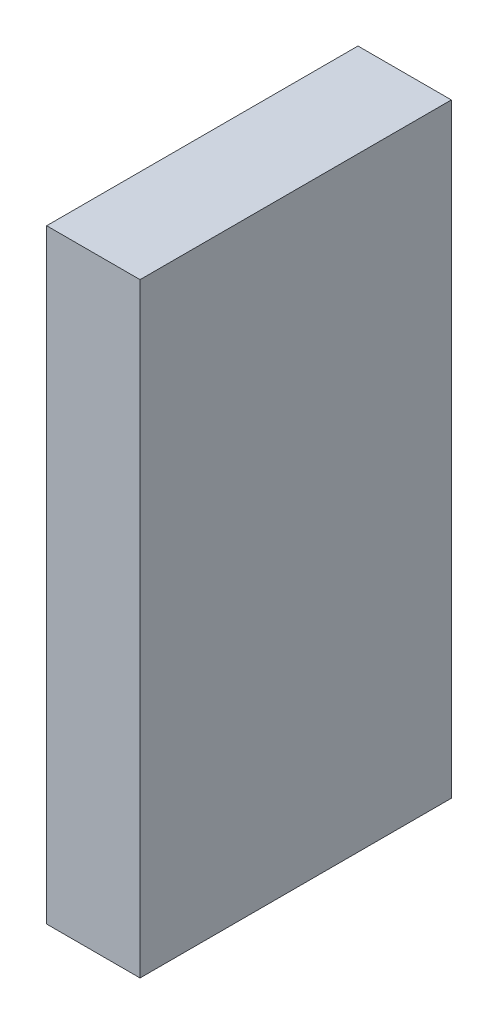
ISO-10303-21;
HEADER;
FILE_DESCRIPTION(('STEP AP214'),'2;1');
FILE_NAME('part.step','',(''),(''),'','','');
FILE_SCHEMA(('AUTOMOTIVE_DESIGN { 1 0 10303 214 1 1 1 1 }'));
ENDSEC;
DATA;
#1=APPLICATION_CONTEXT('core data for automotive mechanical design processes');
#2=APPLICATION_PROTOCOL_DEFINITION('international standard','automotive_design',2000,#1);
#3=PRODUCT_CONTEXT('',#1,'mechanical');
#4=PRODUCT('Part','Part','',(#3));
#5=PRODUCT_RELATED_PRODUCT_CATEGORY('part','',(#4));
#6=PRODUCT_DEFINITION_FORMATION('','',#4);
#7=PRODUCT_DEFINITION_CONTEXT('part definition',#1,'design');
#8=PRODUCT_DEFINITION('design','',#6,#7);
#9=PRODUCT_DEFINITION_SHAPE('','',#8);
#10=(LENGTH_UNIT() NAMED_UNIT(*) SI_UNIT(.MILLI.,.METRE.));
#11=(NAMED_UNIT(*) PLANE_ANGLE_UNIT() SI_UNIT($,.RADIAN.));
#12=(NAMED_UNIT(*) SI_UNIT($,.STERADIAN.) SOLID_ANGLE_UNIT());
#13=UNCERTAINTY_MEASURE_WITH_UNIT(LENGTH_MEASURE(1.E-05),#10,'distance_accuracy_value','');
#14=(GEOMETRIC_REPRESENTATION_CONTEXT(3) GLOBAL_UNCERTAINTY_ASSIGNED_CONTEXT((#13)) GLOBAL_UNIT_ASSIGNED_CONTEXT((#10,
#11,#12)) REPRESENTATION_CONTEXT('',''));
#15=CARTESIAN_POINT('',(0.,0.,0.));
#16=DIRECTION('',(0.,0.,1.));
#17=DIRECTION('',(1.,0.,0.));
#18=AXIS2_PLACEMENT_3D('',#15,#16,#17);
#19=CARTESIAN_POINT('',(0.4815,1.7,0.));
#20=DIRECTION('',(1.,0.,0.));
#21=DIRECTION('',(0.,0.,-1.));
#22=AXIS2_PLACEMENT_3D('',#19,#20,#21);
#23=PLANE('',#22);
#24=DIRECTION('',(0.,0.,-1.));
#25=VECTOR('',#24,1.);
#26=CARTESIAN_POINT('',(0.4815,-1.7,0.));
#27=LINE('',#26,#25);
#28=CARTESIAN_POINT('',(0.4815,-1.7,0.));
#29=VERTEX_POINT('',#28);
#30=CARTESIAN_POINT('',(0.4815,-1.7,1.75));
#31=VERTEX_POINT('',#30);
#32=EDGE_CURVE('E19',#29,#31,#27,.F.);
#33=ORIENTED_EDGE('',*,*,#32,.F.);
#34=DIRECTION('',(0.,1.,0.));
#35=VECTOR('',#34,1.);
#36=CARTESIAN_POINT('',(0.4815,-1.7,0.));
#37=LINE('',#36,#35);
#38=CARTESIAN_POINT('',(0.4815,1.7,0.));
#39=VERTEX_POINT('',#38);
#40=EDGE_CURVE('E79',#29,#39,#37,.T.);
#41=ORIENTED_EDGE('',*,*,#40,.T.);
#42=DIRECTION('',(0.,0.,1.));
#43=VECTOR('',#42,1.);
#44=CARTESIAN_POINT('',(0.4815,1.7,0.));
#45=LINE('',#44,#43);
#46=CARTESIAN_POINT('',(0.4815,1.7,1.75));
#47=VERTEX_POINT('',#46);
#48=EDGE_CURVE('E67',#47,#39,#45,.F.);
#49=ORIENTED_EDGE('',*,*,#48,.F.);
#50=DIRECTION('',(0.,1.,0.));
#51=VECTOR('',#50,1.);
#52=CARTESIAN_POINT('',(0.4815,-1.7,1.75));
#53=LINE('',#52,#51);
#54=EDGE_CURVE('E55',#31,#47,#53,.T.);
#55=ORIENTED_EDGE('',*,*,#54,.F.);
#56=EDGE_LOOP('',(#33,#41,#49,#55));
#57=FACE_BOUND('',#56,.T.);
#58=ADVANCED_FACE('F16',(#57),#23,.T.);
#59=CARTESIAN_POINT('',(0.4815,-1.7,0.));
#60=DIRECTION('',(0.,-1.,0.));
#61=DIRECTION('',(0.,0.,-1.));
#62=AXIS2_PLACEMENT_3D('',#59,#60,#61);
#63=PLANE('',#62);
#64=DIRECTION('',(0.,0.,1.));
#65=VECTOR('',#64,1.);
#66=CARTESIAN_POINT('',(-0.0435,-1.7,0.));
#67=LINE('',#66,#65);
#68=CARTESIAN_POINT('',(-0.0435,-1.7,0.));
#69=VERTEX_POINT('',#68);
#70=CARTESIAN_POINT('',(-0.0435,-1.7,1.75));
#71=VERTEX_POINT('',#70);
#72=EDGE_CURVE('E82',#69,#71,#67,.T.);
#73=ORIENTED_EDGE('',*,*,#72,.F.);
#74=DIRECTION('',(1.,0.,0.));
#75=VECTOR('',#74,1.);
#76=CARTESIAN_POINT('',(-0.0435,-1.7,0.));
#77=LINE('',#76,#75);
#78=EDGE_CURVE('E64',#69,#29,#77,.T.);
#79=ORIENTED_EDGE('',*,*,#78,.T.);
#80=ORIENTED_EDGE('',*,*,#32,.T.);
#81=DIRECTION('',(1.,0.,0.));
#82=VECTOR('',#81,1.);
#83=CARTESIAN_POINT('',(-0.0435,-1.7,1.75));
#84=LINE('',#83,#82);
#85=EDGE_CURVE('E61',#71,#31,#84,.T.);
#86=ORIENTED_EDGE('',*,*,#85,.F.);
#87=EDGE_LOOP('',(#73,#79,#80,#86));
#88=FACE_BOUND('',#87,.T.);
#89=ADVANCED_FACE('F60',(#88),#63,.T.);
#90=CARTESIAN_POINT('',(-0.0435,-1.7,1.75));
#91=DIRECTION('',(0.,0.,1.));
#92=DIRECTION('',(1.,0.,0.));
#93=AXIS2_PLACEMENT_3D('',#90,#91,#92);
#94=PLANE('',#93);
#95=DIRECTION('',(1.,0.,0.));
#96=VECTOR('',#95,1.);
#97=CARTESIAN_POINT('',(-0.0435,1.7,1.75));
#98=LINE('',#97,#96);
#99=CARTESIAN_POINT('',(-0.0435,1.7,1.75));
#100=VERTEX_POINT('',#99);
#101=EDGE_CURVE('E69',#100,#47,#98,.T.);
#102=ORIENTED_EDGE('',*,*,#101,.F.);
#103=DIRECTION('',(0.,1.,0.));
#104=VECTOR('',#103,1.);
#105=CARTESIAN_POINT('',(-0.0435,-1.7,1.75));
#106=LINE('',#105,#104);
#107=EDGE_CURVE('E73',#71,#100,#106,.T.);
#108=ORIENTED_EDGE('',*,*,#107,.F.);
#109=ORIENTED_EDGE('',*,*,#85,.T.);
#110=ORIENTED_EDGE('',*,*,#54,.T.);
#111=EDGE_LOOP('',(#102,#108,#109,#110));
#112=FACE_BOUND('',#111,.T.);
#113=ADVANCED_FACE('F71',(#112),#94,.T.);
#114=CARTESIAN_POINT('',(-0.0435,1.7,0.));
#115=DIRECTION('',(0.,1.,0.));
#116=DIRECTION('',(0.,0.,1.));
#117=AXIS2_PLACEMENT_3D('',#114,#115,#116);
#118=PLANE('',#117);
#119=ORIENTED_EDGE('',*,*,#48,.T.);
#120=DIRECTION('',(1.,0.,0.));
#121=VECTOR('',#120,1.);
#122=CARTESIAN_POINT('',(-0.0435,1.7,0.));
#123=LINE('',#122,#121);
#124=CARTESIAN_POINT('',(-0.0435,1.7,0.));
#125=VERTEX_POINT('',#124);
#126=EDGE_CURVE('E34',#39,#125,#123,.F.);
#127=ORIENTED_EDGE('',*,*,#126,.T.);
#128=DIRECTION('',(0.,0.,1.));
#129=VECTOR('',#128,1.);
#130=CARTESIAN_POINT('',(-0.0435,1.7,0.));
#131=LINE('',#130,#129);
#132=EDGE_CURVE('E25',#100,#125,#131,.F.);
#133=ORIENTED_EDGE('',*,*,#132,.F.);
#134=ORIENTED_EDGE('',*,*,#101,.T.);
#135=EDGE_LOOP('',(#119,#127,#133,#134));
#136=FACE_BOUND('',#135,.T.);
#137=ADVANCED_FACE('F88',(#136),#118,.T.);
#138=CARTESIAN_POINT('',(-0.0435,-1.7,0.));
#139=DIRECTION('',(0.,0.,1.));
#140=DIRECTION('',(1.,0.,0.));
#141=AXIS2_PLACEMENT_3D('',#138,#139,#140);
#142=PLANE('',#141);
#143=ORIENTED_EDGE('',*,*,#126,.F.);
#144=ORIENTED_EDGE('',*,*,#40,.F.);
#145=ORIENTED_EDGE('',*,*,#78,.F.);
#146=DIRECTION('',(0.,1.,0.));
#147=VECTOR('',#146,1.);
#148=CARTESIAN_POINT('',(-0.0435,-1.7,0.));
#149=LINE('',#148,#147);
#150=EDGE_CURVE('E11',#125,#69,#149,.F.);
#151=ORIENTED_EDGE('',*,*,#150,.F.);
#152=EDGE_LOOP('',(#143,#144,#145,#151));
#153=FACE_BOUND('',#152,.T.);
#154=ADVANCED_FACE('F90',(#153),#142,.F.);
#155=CARTESIAN_POINT('',(-0.0435,-1.7,0.));
#156=DIRECTION('',(-1.,0.,0.));
#157=DIRECTION('',(0.,0.,1.));
#158=AXIS2_PLACEMENT_3D('',#155,#156,#157);
#159=PLANE('',#158);
#160=ORIENTED_EDGE('',*,*,#132,.T.);
#161=ORIENTED_EDGE('',*,*,#150,.T.);
#162=ORIENTED_EDGE('',*,*,#72,.T.);
#163=ORIENTED_EDGE('',*,*,#107,.T.);
#164=EDGE_LOOP('',(#160,#161,#162,#163));
#165=FACE_BOUND('',#164,.T.);
#166=ADVANCED_FACE('F87',(#165),#159,.T.);
#167=CLOSED_SHELL('',(#58,#89,#113,#137,#154,#166));
#168=MANIFOLD_SOLID_BREP('B1',#167);
#169=ADVANCED_BREP_SHAPE_REPRESENTATION('',(#18,#168),#14);
#170=SHAPE_DEFINITION_REPRESENTATION(#9,#169);
ENDSEC;
END-ISO-10303-21;
